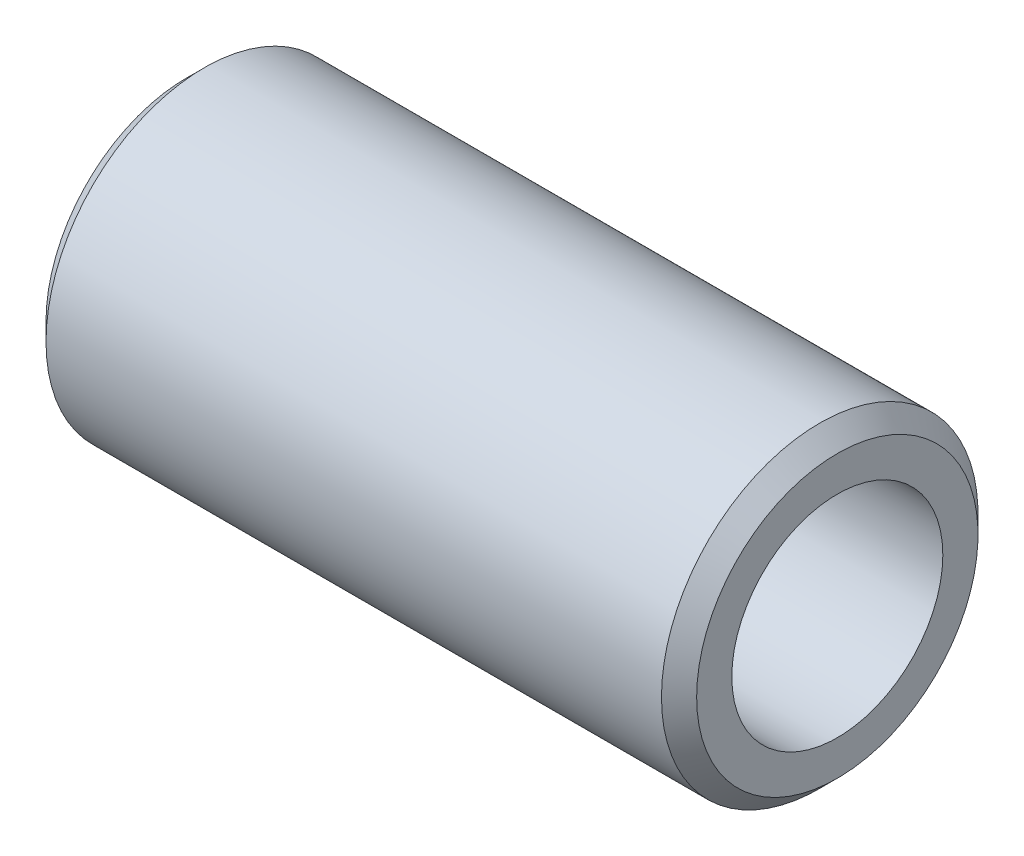
ISO-10303-21;
HEADER;
FILE_DESCRIPTION(('STEP AP214'),'2;1');
FILE_NAME('part.step','',(''),(''),'','','');
FILE_SCHEMA(('AUTOMOTIVE_DESIGN { 1 0 10303 214 1 1 1 1 }'));
ENDSEC;
DATA;
#1=APPLICATION_CONTEXT('core data for automotive mechanical design processes');
#2=APPLICATION_PROTOCOL_DEFINITION('international standard','automotive_design',2000,#1);
#3=PRODUCT_CONTEXT('',#1,'mechanical');
#4=PRODUCT('Part','Part','',(#3));
#5=PRODUCT_RELATED_PRODUCT_CATEGORY('part','',(#4));
#6=PRODUCT_DEFINITION_FORMATION('','',#4);
#7=PRODUCT_DEFINITION_CONTEXT('part definition',#1,'design');
#8=PRODUCT_DEFINITION('design','',#6,#7);
#9=PRODUCT_DEFINITION_SHAPE('','',#8);
#10=(LENGTH_UNIT() NAMED_UNIT(*) SI_UNIT(.MILLI.,.METRE.));
#11=(NAMED_UNIT(*) PLANE_ANGLE_UNIT() SI_UNIT($,.RADIAN.));
#12=(NAMED_UNIT(*) SI_UNIT($,.STERADIAN.) SOLID_ANGLE_UNIT());
#13=UNCERTAINTY_MEASURE_WITH_UNIT(LENGTH_MEASURE(1.E-05),#10,'distance_accuracy_value','');
#14=(GEOMETRIC_REPRESENTATION_CONTEXT(3) GLOBAL_UNCERTAINTY_ASSIGNED_CONTEXT((#13)) GLOBAL_UNIT_ASSIGNED_CONTEXT((#10,
#11,#12)) REPRESENTATION_CONTEXT('',''));
#15=CARTESIAN_POINT('',(0.,0.,0.));
#16=DIRECTION('',(0.,0.,1.));
#17=DIRECTION('',(1.,0.,0.));
#18=AXIS2_PLACEMENT_3D('',#15,#16,#17);
#19=CARTESIAN_POINT('',(0.5,0.,0.));
#20=DIRECTION('',(1.,0.,0.));
#21=DIRECTION('',(0.,0.,-1.));
#22=AXIS2_PLACEMENT_3D('',#19,#20,#21);
#23=CONICAL_SURFACE('',#22,4.5,0.785398163397448);
#24=CARTESIAN_POINT('',(0.,0.,0.));
#25=DIRECTION('',(-1.,0.,0.));
#26=DIRECTION('',(0.,0.,1.));
#27=AXIS2_PLACEMENT_3D('',#24,#25,#26);
#28=CIRCLE('',#27,4.);
#29=CARTESIAN_POINT('',(0.,0.,4.));
#30=VERTEX_POINT('',#29);
#31=EDGE_CURVE('E37',#30,#30,#28,.T.);
#32=ORIENTED_EDGE('',*,*,#31,.F.);
#33=EDGE_LOOP('',(#32));
#34=FACE_BOUND('',#33,.T.);
#35=CARTESIAN_POINT('',(0.5,0.,0.));
#36=DIRECTION('',(-1.,0.,0.));
#37=DIRECTION('',(0.,0.,1.));
#38=AXIS2_PLACEMENT_3D('',#35,#36,#37);
#39=CIRCLE('',#38,4.5);
#40=CARTESIAN_POINT('',(0.5,0.,4.5));
#41=VERTEX_POINT('',#40);
#42=EDGE_CURVE('E10',#41,#41,#39,.T.);
#43=ORIENTED_EDGE('',*,*,#42,.T.);
#44=EDGE_LOOP('',(#43));
#45=FACE_BOUND('',#44,.T.);
#46=ADVANCED_FACE('F15',(#34,#45),#23,.T.);
#47=CARTESIAN_POINT('',(18.5,0.,0.));
#48=DIRECTION('',(-1.,0.,0.));
#49=DIRECTION('',(0.,0.,1.));
#50=AXIS2_PLACEMENT_3D('',#47,#48,#49);
#51=CYLINDRICAL_SURFACE('',#50,4.5);
#52=ORIENTED_EDGE('',*,*,#42,.F.);
#53=EDGE_LOOP('',(#52));
#54=FACE_BOUND('',#53,.T.);
#55=CARTESIAN_POINT('',(18.,0.,0.));
#56=DIRECTION('',(-1.,0.,0.));
#57=DIRECTION('',(0.,0.,1.));
#58=AXIS2_PLACEMENT_3D('',#55,#56,#57);
#59=CIRCLE('',#58,4.5);
#60=CARTESIAN_POINT('',(18.,0.,4.5));
#61=VERTEX_POINT('',#60);
#62=EDGE_CURVE('E21',#61,#61,#59,.T.);
#63=ORIENTED_EDGE('',*,*,#62,.T.);
#64=EDGE_LOOP('',(#63));
#65=FACE_BOUND('',#64,.T.);
#66=ADVANCED_FACE('F44',(#54,#65),#51,.T.);
#67=CARTESIAN_POINT('',(18.5,0.,0.));
#68=DIRECTION('',(-1.,0.,0.));
#69=DIRECTION('',(0.,0.,1.));
#70=AXIS2_PLACEMENT_3D('',#67,#68,#69);
#71=CONICAL_SURFACE('',#70,4.,0.785398163397448);
#72=ORIENTED_EDGE('',*,*,#62,.F.);
#73=EDGE_LOOP('',(#72));
#74=FACE_BOUND('',#73,.T.);
#75=CARTESIAN_POINT('',(18.5,0.,0.));
#76=DIRECTION('',(-1.,0.,0.));
#77=DIRECTION('',(0.,0.,1.));
#78=AXIS2_PLACEMENT_3D('',#75,#76,#77);
#79=CIRCLE('',#78,4.);
#80=CARTESIAN_POINT('',(18.5,0.,4.));
#81=VERTEX_POINT('',#80);
#82=EDGE_CURVE('E25',#81,#81,#79,.T.);
#83=ORIENTED_EDGE('',*,*,#82,.T.);
#84=EDGE_LOOP('',(#83));
#85=FACE_BOUND('',#84,.T.);
#86=ADVANCED_FACE('F50',(#74,#85),#71,.T.);
#87=CARTESIAN_POINT('',(18.5,3.,0.));
#88=DIRECTION('',(-1.,0.,0.));
#89=DIRECTION('',(0.,0.,1.));
#90=AXIS2_PLACEMENT_3D('',#87,#88,#89);
#91=PLANE('',#90);
#92=ORIENTED_EDGE('',*,*,#82,.F.);
#93=EDGE_LOOP('',(#92));
#94=FACE_BOUND('',#93,.T.);
#95=CARTESIAN_POINT('',(18.5,0.,0.));
#96=DIRECTION('',(-1.,0.,0.));
#97=DIRECTION('',(0.,0.,1.));
#98=AXIS2_PLACEMENT_3D('',#95,#96,#97);
#99=CIRCLE('',#98,3.);
#100=CARTESIAN_POINT('',(18.5,0.,3.));
#101=VERTEX_POINT('',#100);
#102=EDGE_CURVE('E29',#101,#101,#99,.T.);
#103=ORIENTED_EDGE('',*,*,#102,.T.);
#104=EDGE_LOOP('',(#103));
#105=FACE_BOUND('',#104,.T.);
#106=ADVANCED_FACE('F56',(#94,#105),#91,.F.);
#107=CARTESIAN_POINT('',(18.5,0.,0.));
#108=DIRECTION('',(-1.,0.,0.));
#109=DIRECTION('',(0.,0.,1.));
#110=AXIS2_PLACEMENT_3D('',#107,#108,#109);
#111=CYLINDRICAL_SURFACE('',#110,3.);
#112=ORIENTED_EDGE('',*,*,#102,.F.);
#113=EDGE_LOOP('',(#112));
#114=FACE_BOUND('',#113,.T.);
#115=CARTESIAN_POINT('',(0.,0.,0.));
#116=DIRECTION('',(-1.,0.,0.));
#117=DIRECTION('',(0.,0.,1.));
#118=AXIS2_PLACEMENT_3D('',#115,#116,#117);
#119=CIRCLE('',#118,3.);
#120=CARTESIAN_POINT('',(0.,0.,3.));
#121=VERTEX_POINT('',#120);
#122=EDGE_CURVE('E34',#121,#121,#119,.T.);
#123=ORIENTED_EDGE('',*,*,#122,.T.);
#124=EDGE_LOOP('',(#123));
#125=FACE_BOUND('',#124,.T.);
#126=ADVANCED_FACE('F62',(#114,#125),#111,.F.);
#127=CARTESIAN_POINT('',(0.,4.,0.));
#128=DIRECTION('',(1.,0.,0.));
#129=DIRECTION('',(0.,0.,-1.));
#130=AXIS2_PLACEMENT_3D('',#127,#128,#129);
#131=PLANE('',#130);
#132=ORIENTED_EDGE('',*,*,#122,.F.);
#133=EDGE_LOOP('',(#132));
#134=FACE_BOUND('',#133,.T.);
#135=ORIENTED_EDGE('',*,*,#31,.T.);
#136=EDGE_LOOP('',(#135));
#137=FACE_BOUND('',#136,.T.);
#138=ADVANCED_FACE('F41',(#134,#137),#131,.F.);
#139=CLOSED_SHELL('',(#46,#66,#86,#106,#126,#138));
#140=MANIFOLD_SOLID_BREP('B1',#139);
#141=ADVANCED_BREP_SHAPE_REPRESENTATION('',(#18,#140),#14);
#142=SHAPE_DEFINITION_REPRESENTATION(#9,#141);
ENDSEC;
END-ISO-10303-21;
